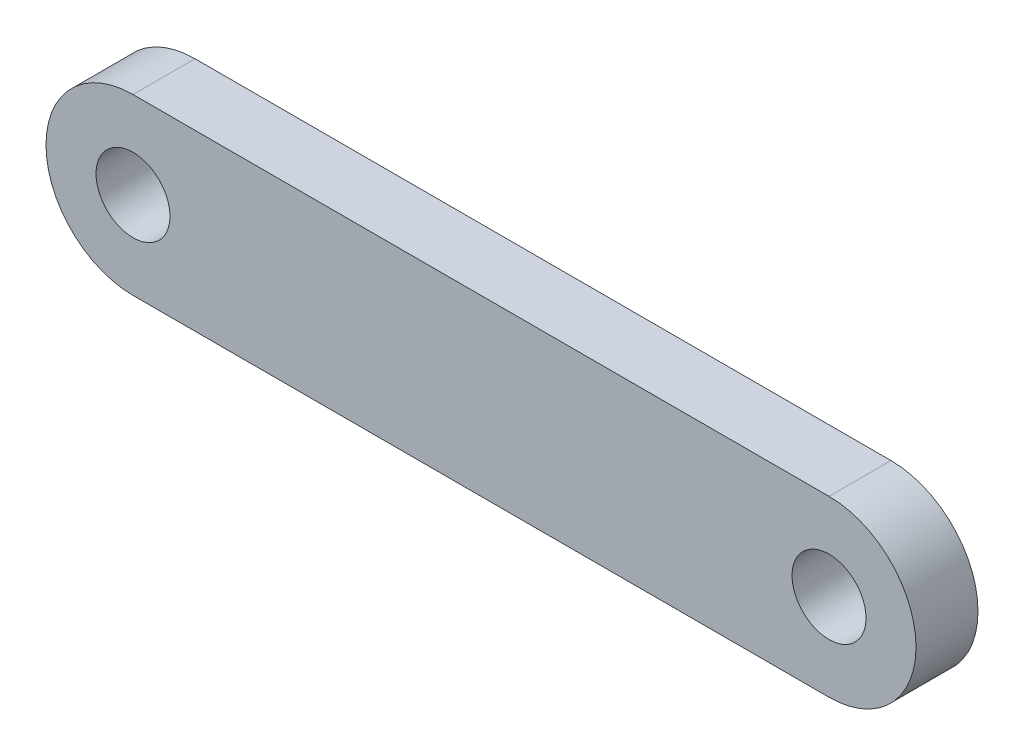
ISO-10303-21;
HEADER;
FILE_DESCRIPTION(('STEP AP214'),'2;1');
FILE_NAME('part.step','',(''),(''),'','','');
FILE_SCHEMA(('AUTOMOTIVE_DESIGN { 1 0 10303 214 1 1 1 1 }'));
ENDSEC;
DATA;
#1=APPLICATION_CONTEXT('core data for automotive mechanical design processes');
#2=APPLICATION_PROTOCOL_DEFINITION('international standard','automotive_design',2000,#1);
#3=PRODUCT_CONTEXT('',#1,'mechanical');
#4=PRODUCT('Part','Part','',(#3));
#5=PRODUCT_RELATED_PRODUCT_CATEGORY('part','',(#4));
#6=PRODUCT_DEFINITION_FORMATION('','',#4);
#7=PRODUCT_DEFINITION_CONTEXT('part definition',#1,'design');
#8=PRODUCT_DEFINITION('design','',#6,#7);
#9=PRODUCT_DEFINITION_SHAPE('','',#8);
#10=(LENGTH_UNIT() NAMED_UNIT(*) SI_UNIT(.MILLI.,.METRE.));
#11=(NAMED_UNIT(*) PLANE_ANGLE_UNIT() SI_UNIT($,.RADIAN.));
#12=(NAMED_UNIT(*) SI_UNIT($,.STERADIAN.) SOLID_ANGLE_UNIT());
#13=UNCERTAINTY_MEASURE_WITH_UNIT(LENGTH_MEASURE(1.E-05),#10,'distance_accuracy_value','');
#14=(GEOMETRIC_REPRESENTATION_CONTEXT(3) GLOBAL_UNCERTAINTY_ASSIGNED_CONTEXT((#13)) GLOBAL_UNIT_ASSIGNED_CONTEXT((#10,
#11,#12)) REPRESENTATION_CONTEXT('',''));
#15=CARTESIAN_POINT('',(0.,0.,0.));
#16=DIRECTION('',(0.,0.,1.));
#17=DIRECTION('',(1.,0.,0.));
#18=AXIS2_PLACEMENT_3D('',#15,#16,#17);
#19=CARTESIAN_POINT('',(0.,0.,2.85));
#20=DIRECTION('',(0.,0.,1.));
#21=DIRECTION('',(1.,0.,0.));
#22=AXIS2_PLACEMENT_3D('',#19,#20,#21);
#23=PLANE('',#22);
#24=DIRECTION('',(-1.,0.,0.));
#25=VECTOR('',#24,1.);
#26=CARTESIAN_POINT('',(-20.,4.,2.85));
#27=LINE('',#26,#25);
#28=CARTESIAN_POINT('',(16.,4.,2.85));
#29=VERTEX_POINT('',#28);
#30=CARTESIAN_POINT('',(-16.,4.,2.85));
#31=VERTEX_POINT('',#30);
#32=EDGE_CURVE('E79',#29,#31,#27,.T.);
#33=ORIENTED_EDGE('',*,*,#32,.T.);
#34=CARTESIAN_POINT('',(-16.,0.,2.85));
#35=DIRECTION('',(0.,0.,1.));
#36=DIRECTION('',(-1.,0.,0.));
#37=AXIS2_PLACEMENT_3D('',#34,#35,#36);
#38=CIRCLE('',#37,4.);
#39=CARTESIAN_POINT('',(-16.,-4.,2.85));
#40=VERTEX_POINT('',#39);
#41=EDGE_CURVE('E76',#31,#40,#38,.T.);
#42=ORIENTED_EDGE('',*,*,#41,.T.);
#43=DIRECTION('',(1.,0.,0.));
#44=VECTOR('',#43,1.);
#45=CARTESIAN_POINT('',(-20.,-4.,2.85));
#46=LINE('',#45,#44);
#47=CARTESIAN_POINT('',(16.,-4.,2.85));
#48=VERTEX_POINT('',#47);
#49=EDGE_CURVE('E61',#40,#48,#46,.T.);
#50=ORIENTED_EDGE('',*,*,#49,.T.);
#51=CARTESIAN_POINT('',(16.,0.,2.85));
#52=DIRECTION('',(0.,0.,-1.));
#53=DIRECTION('',(1.,0.,0.));
#54=AXIS2_PLACEMENT_3D('',#51,#52,#53);
#55=CIRCLE('',#54,4.);
#56=EDGE_CURVE('E104',#29,#48,#55,.T.);
#57=ORIENTED_EDGE('',*,*,#56,.F.);
#58=EDGE_LOOP('',(#33,#42,#50,#57));
#59=FACE_BOUND('',#58,.T.);
#60=CARTESIAN_POINT('',(16.,0.,2.85));
#61=DIRECTION('',(0.,0.,1.));
#62=DIRECTION('',(1.,0.,0.));
#63=AXIS2_PLACEMENT_3D('',#60,#61,#62);
#64=CIRCLE('',#63,1.7);
#65=CARTESIAN_POINT('',(17.7,0.,2.85));
#66=VERTEX_POINT('',#65);
#67=EDGE_CURVE('E88',#66,#66,#64,.T.);
#68=ORIENTED_EDGE('',*,*,#67,.F.);
#69=EDGE_LOOP('',(#68));
#70=FACE_BOUND('',#69,.T.);
#71=CARTESIAN_POINT('',(-16.,0.,2.85));
#72=DIRECTION('',(0.,0.,-1.));
#73=DIRECTION('',(-1.,0.,0.));
#74=AXIS2_PLACEMENT_3D('',#71,#72,#73);
#75=CIRCLE('',#74,1.7);
#76=CARTESIAN_POINT('',(-17.7,0.,2.85));
#77=VERTEX_POINT('',#76);
#78=EDGE_CURVE('E118',#77,#77,#75,.T.);
#79=ORIENTED_EDGE('',*,*,#78,.T.);
#80=EDGE_LOOP('',(#79));
#81=FACE_BOUND('',#80,.T.);
#82=ADVANCED_FACE('F33',(#59,#70,#81),#23,.T.);
#83=CARTESIAN_POINT('',(0.,0.,0.));
#84=DIRECTION('',(0.,0.,1.));
#85=DIRECTION('',(1.,0.,0.));
#86=AXIS2_PLACEMENT_3D('',#83,#84,#85);
#87=PLANE('',#86);
#88=CARTESIAN_POINT('',(-16.,0.,0.));
#89=DIRECTION('',(0.,0.,1.));
#90=DIRECTION('',(1.,0.,0.));
#91=AXIS2_PLACEMENT_3D('',#88,#89,#90);
#92=CIRCLE('',#91,4.);
#93=CARTESIAN_POINT('',(-16.,4.,0.));
#94=VERTEX_POINT('',#93);
#95=CARTESIAN_POINT('',(-16.,-4.,0.));
#96=VERTEX_POINT('',#95);
#97=EDGE_CURVE('E11',#94,#96,#92,.T.);
#98=ORIENTED_EDGE('',*,*,#97,.F.);
#99=DIRECTION('',(-1.,0.,0.));
#100=VECTOR('',#99,1.);
#101=CARTESIAN_POINT('',(-20.,4.,0.));
#102=LINE('',#101,#100);
#103=CARTESIAN_POINT('',(16.,4.,0.));
#104=VERTEX_POINT('',#103);
#105=EDGE_CURVE('E98',#104,#94,#102,.T.);
#106=ORIENTED_EDGE('',*,*,#105,.F.);
#107=CARTESIAN_POINT('',(16.,0.,0.));
#108=DIRECTION('',(0.,0.,1.));
#109=DIRECTION('',(1.,0.,0.));
#110=AXIS2_PLACEMENT_3D('',#107,#108,#109);
#111=CIRCLE('',#110,4.);
#112=CARTESIAN_POINT('',(16.,-4.,0.));
#113=VERTEX_POINT('',#112);
#114=EDGE_CURVE('E42',#104,#113,#111,.F.);
#115=ORIENTED_EDGE('',*,*,#114,.T.);
#116=DIRECTION('',(1.,0.,0.));
#117=VECTOR('',#116,1.);
#118=CARTESIAN_POINT('',(-20.,-4.,0.));
#119=LINE('',#118,#117);
#120=EDGE_CURVE('E94',#96,#113,#119,.T.);
#121=ORIENTED_EDGE('',*,*,#120,.F.);
#122=EDGE_LOOP('',(#98,#106,#115,#121));
#123=FACE_BOUND('',#122,.T.);
#124=CARTESIAN_POINT('',(16.,0.,0.));
#125=DIRECTION('',(0.,0.,1.));
#126=DIRECTION('',(1.,0.,0.));
#127=AXIS2_PLACEMENT_3D('',#124,#125,#126);
#128=CIRCLE('',#127,1.7);
#129=CARTESIAN_POINT('',(17.7,0.,0.));
#130=VERTEX_POINT('',#129);
#131=EDGE_CURVE('E112',#130,#130,#128,.T.);
#132=ORIENTED_EDGE('',*,*,#131,.T.);
#133=EDGE_LOOP('',(#132));
#134=FACE_BOUND('',#133,.T.);
#135=CARTESIAN_POINT('',(-16.,0.,0.));
#136=DIRECTION('',(0.,0.,-1.));
#137=DIRECTION('',(-1.,0.,0.));
#138=AXIS2_PLACEMENT_3D('',#135,#136,#137);
#139=CIRCLE('',#138,1.7);
#140=CARTESIAN_POINT('',(-17.7,0.,0.));
#141=VERTEX_POINT('',#140);
#142=EDGE_CURVE('E82',#141,#141,#139,.T.);
#143=ORIENTED_EDGE('',*,*,#142,.F.);
#144=EDGE_LOOP('',(#143));
#145=FACE_BOUND('',#144,.T.);
#146=ADVANCED_FACE('F106',(#123,#134,#145),#87,.F.);
#147=CARTESIAN_POINT('',(-20.,-4.,2.85));
#148=DIRECTION('',(0.,1.,0.));
#149=DIRECTION('',(0.,0.,1.));
#150=AXIS2_PLACEMENT_3D('',#147,#148,#149);
#151=PLANE('',#150);
#152=DIRECTION('',(0.,0.,1.));
#153=VECTOR('',#152,1.);
#154=CARTESIAN_POINT('',(-16.,-4.,0.));
#155=LINE('',#154,#153);
#156=EDGE_CURVE('E84',#96,#40,#155,.T.);
#157=ORIENTED_EDGE('',*,*,#156,.F.);
#158=ORIENTED_EDGE('',*,*,#120,.T.);
#159=DIRECTION('',(0.,0.,1.));
#160=VECTOR('',#159,1.);
#161=CARTESIAN_POINT('',(16.,-4.,0.));
#162=LINE('',#161,#160);
#163=EDGE_CURVE('E92',#113,#48,#162,.T.);
#164=ORIENTED_EDGE('',*,*,#163,.T.);
#165=ORIENTED_EDGE('',*,*,#49,.F.);
#166=EDGE_LOOP('',(#157,#158,#164,#165));
#167=FACE_BOUND('',#166,.T.);
#168=ADVANCED_FACE('F91',(#167),#151,.F.);
#169=CARTESIAN_POINT('',(-20.,4.,2.85));
#170=DIRECTION('',(0.,-1.,0.));
#171=DIRECTION('',(0.,0.,-1.));
#172=AXIS2_PLACEMENT_3D('',#169,#170,#171);
#173=PLANE('',#172);
#174=ORIENTED_EDGE('',*,*,#105,.T.);
#175=DIRECTION('',(0.,0.,1.));
#176=VECTOR('',#175,1.);
#177=CARTESIAN_POINT('',(-16.,4.,0.));
#178=LINE('',#177,#176);
#179=EDGE_CURVE('E81',#94,#31,#178,.T.);
#180=ORIENTED_EDGE('',*,*,#179,.T.);
#181=ORIENTED_EDGE('',*,*,#32,.F.);
#182=DIRECTION('',(0.,0.,1.));
#183=VECTOR('',#182,1.);
#184=CARTESIAN_POINT('',(16.,4.,0.));
#185=LINE('',#184,#183);
#186=EDGE_CURVE('E101',#104,#29,#185,.T.);
#187=ORIENTED_EDGE('',*,*,#186,.F.);
#188=EDGE_LOOP('',(#174,#180,#181,#187));
#189=FACE_BOUND('',#188,.T.);
#190=ADVANCED_FACE('F35',(#189),#173,.F.);
#191=CARTESIAN_POINT('',(16.,0.,0.));
#192=DIRECTION('',(0.,0.,1.));
#193=DIRECTION('',(1.,0.,0.));
#194=AXIS2_PLACEMENT_3D('',#191,#192,#193);
#195=CYLINDRICAL_SURFACE('',#194,4.);
#196=ORIENTED_EDGE('',*,*,#56,.T.);
#197=ORIENTED_EDGE('',*,*,#163,.F.);
#198=ORIENTED_EDGE('',*,*,#114,.F.);
#199=ORIENTED_EDGE('',*,*,#186,.T.);
#200=EDGE_LOOP('',(#196,#197,#198,#199));
#201=FACE_BOUND('',#200,.T.);
#202=ADVANCED_FACE('F103',(#201),#195,.T.);
#203=CARTESIAN_POINT('',(16.,0.,0.));
#204=DIRECTION('',(0.,0.,1.));
#205=DIRECTION('',(1.,0.,0.));
#206=AXIS2_PLACEMENT_3D('',#203,#204,#205);
#207=CYLINDRICAL_SURFACE('',#206,1.7);
#208=ORIENTED_EDGE('',*,*,#131,.F.);
#209=EDGE_LOOP('',(#208));
#210=FACE_BOUND('',#209,.T.);
#211=ORIENTED_EDGE('',*,*,#67,.T.);
#212=EDGE_LOOP('',(#211));
#213=FACE_BOUND('',#212,.T.);
#214=ADVANCED_FACE('F137',(#210,#213),#207,.F.);
#215=CARTESIAN_POINT('',(-16.,0.,0.));
#216=DIRECTION('',(0.,0.,1.));
#217=DIRECTION('',(1.,0.,0.));
#218=AXIS2_PLACEMENT_3D('',#215,#216,#217);
#219=CYLINDRICAL_SURFACE('',#218,4.);
#220=ORIENTED_EDGE('',*,*,#179,.F.);
#221=ORIENTED_EDGE('',*,*,#97,.T.);
#222=ORIENTED_EDGE('',*,*,#156,.T.);
#223=ORIENTED_EDGE('',*,*,#41,.F.);
#224=EDGE_LOOP('',(#220,#221,#222,#223));
#225=FACE_BOUND('',#224,.T.);
#226=ADVANCED_FACE('F85',(#225),#219,.T.);
#227=CARTESIAN_POINT('',(-16.,0.,0.));
#228=DIRECTION('',(0.,0.,1.));
#229=DIRECTION('',(1.,0.,0.));
#230=AXIS2_PLACEMENT_3D('',#227,#228,#229);
#231=CYLINDRICAL_SURFACE('',#230,1.7);
#232=ORIENTED_EDGE('',*,*,#142,.T.);
#233=EDGE_LOOP('',(#232));
#234=FACE_BOUND('',#233,.T.);
#235=ORIENTED_EDGE('',*,*,#78,.F.);
#236=EDGE_LOOP('',(#235));
#237=FACE_BOUND('',#236,.T.);
#238=ADVANCED_FACE('F124',(#234,#237),#231,.F.);
#239=CLOSED_SHELL('',(#82,#146,#168,#190,#202,#214,#226,#238));
#240=MANIFOLD_SOLID_BREP('B2',#239);
#241=ADVANCED_BREP_SHAPE_REPRESENTATION('',(#18,#240),#14);
#242=SHAPE_DEFINITION_REPRESENTATION(#9,#241);
ENDSEC;
END-ISO-10303-21;
